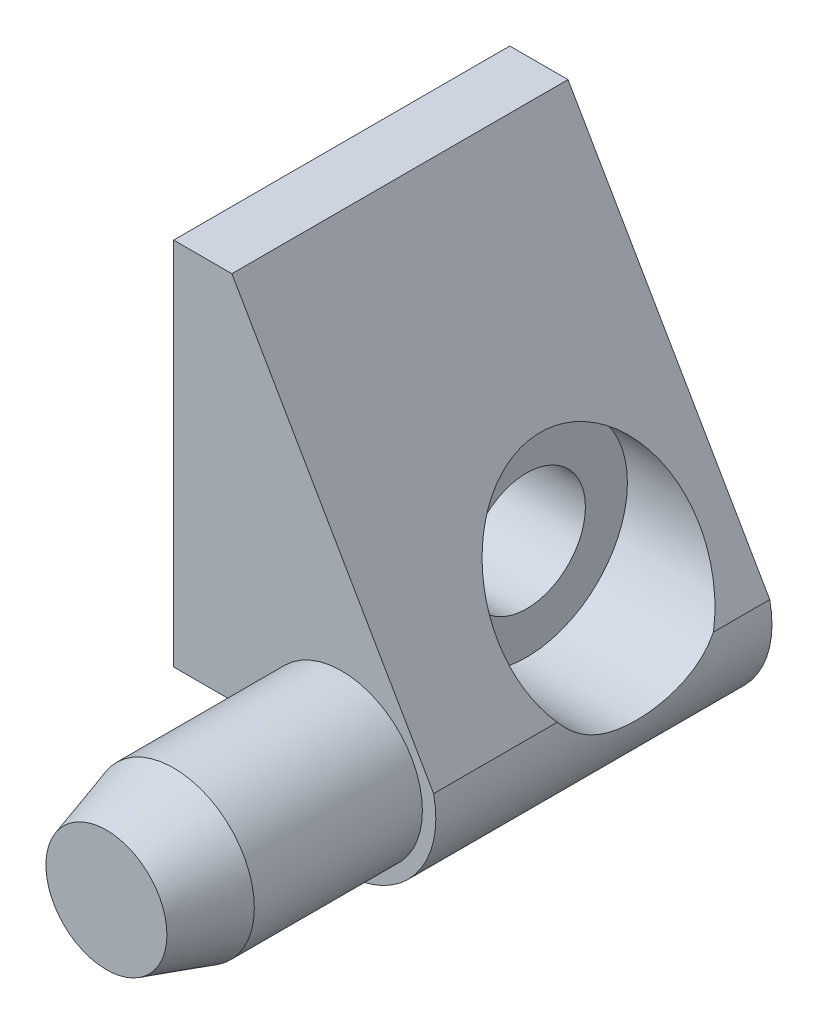
ISO-10303-21;
HEADER;
FILE_DESCRIPTION(('STEP AP214'),'2;1');
FILE_NAME('part.step','',(''),(''),'','','');
FILE_SCHEMA(('AUTOMOTIVE_DESIGN { 1 0 10303 214 1 1 1 1 }'));
ENDSEC;
DATA;
#1=APPLICATION_CONTEXT('core data for automotive mechanical design processes');
#2=APPLICATION_PROTOCOL_DEFINITION('international standard','automotive_design',2000,#1);
#3=PRODUCT_CONTEXT('',#1,'mechanical');
#4=PRODUCT('Part','Part','',(#3));
#5=PRODUCT_RELATED_PRODUCT_CATEGORY('part','',(#4));
#6=PRODUCT_DEFINITION_FORMATION('','',#4);
#7=PRODUCT_DEFINITION_CONTEXT('part definition',#1,'design');
#8=PRODUCT_DEFINITION('design','',#6,#7);
#9=PRODUCT_DEFINITION_SHAPE('','',#8);
#10=(LENGTH_UNIT() NAMED_UNIT(*) SI_UNIT(.MILLI.,.METRE.));
#11=(NAMED_UNIT(*) PLANE_ANGLE_UNIT() SI_UNIT($,.RADIAN.));
#12=(NAMED_UNIT(*) SI_UNIT($,.STERADIAN.) SOLID_ANGLE_UNIT());
#13=UNCERTAINTY_MEASURE_WITH_UNIT(LENGTH_MEASURE(1.E-05),#10,'distance_accuracy_value','');
#14=(GEOMETRIC_REPRESENTATION_CONTEXT(3) GLOBAL_UNCERTAINTY_ASSIGNED_CONTEXT((#13)) GLOBAL_UNIT_ASSIGNED_CONTEXT((#10,
#11,#12)) REPRESENTATION_CONTEXT('',''));
#15=CARTESIAN_POINT('',(0.,0.,0.));
#16=DIRECTION('',(0.,0.,1.));
#17=DIRECTION('',(1.,0.,0.));
#18=AXIS2_PLACEMENT_3D('',#15,#16,#17);
#19=CARTESIAN_POINT('',(0.,6.,10.));
#20=DIRECTION('',(0.,0.,-1.));
#21=DIRECTION('',(-1.,0.,0.));
#22=AXIS2_PLACEMENT_3D('',#19,#20,#21);
#23=CYLINDRICAL_SURFACE('',#22,2.8);
#24=CARTESIAN_POINT('',(2.73401258824942,6.60429725077458,6.32514754081954));
#25=CARTESIAN_POINT('',(2.74718072656134,6.54473329061629,6.27661206166968));
#26=CARTESIAN_POINT('',(2.75794742641717,6.48677528015598,6.22552383453521));
#27=CARTESIAN_POINT('',(2.775391199646,6.37471394469099,6.11875155349098));
#28=CARTESIAN_POINT('',(2.78207281882174,6.32060639444985,6.06307268657882));
#29=CARTESIAN_POINT('',(2.79206208995295,6.21699944991811,5.94779236332611));
#30=CARTESIAN_POINT('',(2.79538558052693,6.16747943341758,5.88821074583283));
#31=CARTESIAN_POINT('',(2.7994418775473,6.0731566366032,5.76534300153487));
#32=CARTESIAN_POINT('',(2.80017400490563,6.02835509578867,5.70205590809603));
#33=CARTESIAN_POINT('',(2.79954975768704,5.90184872038577,5.50777857292563));
#34=CARTESIAN_POINT('',(2.79540389985316,5.82758274640864,5.37186011603755));
#35=CARTESIAN_POINT('',(2.78470302165556,5.70081697666656,5.09016963028011));
#36=CARTESIAN_POINT('',(2.77814520806697,5.64834256777212,4.94438633756374));
#37=CARTESIAN_POINT('',(2.76919130599023,5.58520062474181,4.7148162894273));
#38=CARTESIAN_POINT('',(2.7662646651996,5.5663925280862,4.63321228242288));
#39=CARTESIAN_POINT('',(2.76127449611067,5.5356593564555,4.46869879910973));
#40=CARTESIAN_POINT('',(2.75921071636998,5.52373227592951,4.3857897104267));
#41=CARTESIAN_POINT('',(2.75624346949717,5.5068528881893,4.21926112766045));
#42=CARTESIAN_POINT('',(2.75533981035914,5.50189942679221,4.13564175343976));
#43=CARTESIAN_POINT('',(2.75481438021028,5.49900057987198,3.96827778270407));
#44=CARTESIAN_POINT('',(2.75519258463052,5.50105506003073,3.88453318861987));
#45=CARTESIAN_POINT('',(2.75717608756015,5.51213613103983,3.71782328784866));
#46=CARTESIAN_POINT('',(2.75877699431904,5.52113777002203,3.63485626550932));
#47=CARTESIAN_POINT('',(2.76298008523361,5.54601778642342,3.46995838527709));
#48=CARTESIAN_POINT('',(2.7655826030893,5.56189845590444,3.38802788212051));
#49=CARTESIAN_POINT('',(2.77141200730581,5.60043174504579,3.22575015863993));
#50=CARTESIAN_POINT('',(2.77463924514248,5.62308818077207,3.14540385778031));
#51=CARTESIAN_POINT('',(2.7812006273411,5.67502627924548,2.98684313639012));
#52=CARTESIAN_POINT('',(2.78453482343692,5.70431119084126,2.90862978242611));
#53=CARTESIAN_POINT('',(2.79070057944241,5.76961819592607,2.75416158134688));
#54=CARTESIAN_POINT('',(2.79352702976725,5.80570201669808,2.6779326036758));
#55=CARTESIAN_POINT('',(2.79787921892826,5.88417516278746,2.52875473370924));
#56=CARTESIAN_POINT('',(2.79940503919917,5.92656409313559,2.45580563632564));
#57=CARTESIAN_POINT('',(2.80031296964785,6.0172377109699,2.31389099550421));
#58=CARTESIAN_POINT('',(2.799700176977,6.06550811570281,2.24491637801423));
#59=CARTESIAN_POINT('',(2.79544587567934,6.16760270048371,2.11135373200488));
#60=CARTESIAN_POINT('',(2.79180611423416,6.22142366102797,2.04676319622825));
#61=CARTESIAN_POINT('',(2.78113513814166,6.32844806847868,1.92875777478006));
#62=CARTESIAN_POINT('',(2.77448177351817,6.38116936040093,1.87487222508268));
#63=CARTESIAN_POINT('',(2.75731145841885,6.49018799656369,1.77147299376054));
#64=CARTESIAN_POINT('',(2.74679283290449,6.54648688241882,1.72196121909831));
#65=CARTESIAN_POINT('',(2.73401258824942,6.60429725077458,1.67485245918046));
#66=B_SPLINE_CURVE_WITH_KNOTS('',3,(#24,#25,#26,#27,#28,#29,#30,#31,#32,#33,#34,#35,#36,#37,#38,
#39,#40,#41,#42,#43,#44,#45,#46,#47,#48,#49,#50,#51,#52,#53,#54,#55,#56,#57,#58,#59,#60,#61,#62,
#63,#64,#65),.UNSPECIFIED.,.F.,.F.,(4,2,2,2,2,2,2,2,2,2,2,2,2,2,2,2,2,2,2,2,4),(0.,
0.233707661765087,0.467154782332596,0.699495636168674,0.931897372330957,1.39465974870193,
1.85795973460061,2.10908726514052,2.36014156466199,2.61115430804974,2.86216224041415,
3.11227280810749,3.36246677568963,3.61280191703674,3.86326002314185,4.11611235781464,
4.36894885979388,4.62118316542379,4.87327198110804,5.10001080169107,5.32684799726922),.UNSPECIFIED.);
#67=CARTESIAN_POINT('',(2.73401258824942,6.60429725077458,6.32514754081954));
#68=VERTEX_POINT('',#67);
#69=CARTESIAN_POINT('',(2.73401258824942,6.60429725077458,1.67485245918047));
#70=VERTEX_POINT('',#69);
#71=EDGE_CURVE('E48',#68,#70,#66,.T.);
#72=ORIENTED_EDGE('',*,*,#71,.F.);
#73=DIRECTION('',(0.,0.,-1.));
#74=VECTOR('',#73,1.);
#75=CARTESIAN_POINT('',(2.73401258824942,6.60429725077458,10.));
#76=LINE('',#75,#74);
#77=CARTESIAN_POINT('',(2.73401258824942,6.60429725077458,10.));
#78=VERTEX_POINT('',#77);
#79=EDGE_CURVE('E56',#78,#68,#76,.T.);
#80=ORIENTED_EDGE('',*,*,#79,.F.);
#81=CARTESIAN_POINT('',(0.,6.,10.));
#82=DIRECTION('',(0.,0.,-1.));
#83=DIRECTION('',(-1.,0.,0.));
#84=AXIS2_PLACEMENT_3D('',#81,#82,#83);
#85=CIRCLE('',#84,2.8);
#86=CARTESIAN_POINT('',(-2.8,6.,10.));
#87=VERTEX_POINT('',#86);
#88=EDGE_CURVE('E122',#78,#87,#85,.T.);
#89=ORIENTED_EDGE('',*,*,#88,.T.);
#90=DIRECTION('',(0.,0.,-1.));
#91=VECTOR('',#90,1.);
#92=CARTESIAN_POINT('',(-2.8,6.,10.));
#93=LINE('',#92,#91);
#94=CARTESIAN_POINT('',(-2.8,6.,0.));
#95=VERTEX_POINT('',#94);
#96=EDGE_CURVE('E89',#87,#95,#93,.T.);
#97=ORIENTED_EDGE('',*,*,#96,.T.);
#98=CARTESIAN_POINT('',(0.,6.,0.));
#99=DIRECTION('',(0.,0.,-1.));
#100=DIRECTION('',(-1.,0.,0.));
#101=AXIS2_PLACEMENT_3D('',#98,#99,#100);
#102=CIRCLE('',#101,2.8);
#103=CARTESIAN_POINT('',(2.73401258824942,6.60429725077458,0.));
#104=VERTEX_POINT('',#103);
#105=EDGE_CURVE('E127',#104,#95,#102,.T.);
#106=ORIENTED_EDGE('',*,*,#105,.F.);
#107=EDGE_CURVE('E81',#70,#104,#76,.T.);
#108=ORIENTED_EDGE('',*,*,#107,.F.);
#109=EDGE_LOOP('',(#72,#80,#89,#97,#106,#108));
#110=FACE_BOUND('',#109,.T.);
#111=ADVANCED_FACE('F35',(#110),#23,.T.);
#112=CARTESIAN_POINT('',(-3.267949192431,17.,10.));
#113=DIRECTION('',(0.866025403784446,0.499999999999987,0.));
#114=DIRECTION('',(-0.499999999999987,0.866025403784446,0.));
#115=AXIS2_PLACEMENT_3D('',#112,#113,#114);
#116=PLANE('',#115);
#117=CARTESIAN_POINT('',(1.63952809568065,8.5,4.));
#118=DIRECTION('',(0.866025403784446,0.499999999999987,0.));
#119=DIRECTION('',(0.499999999999987,-0.866025403784446,0.));
#120=AXIS2_PLACEMENT_3D('',#117,#118,#119);
#121=ELLIPSE('',#120,3.46410161513772,3.);
#122=EDGE_CURVE('E11',#70,#68,#121,.T.);
#123=ORIENTED_EDGE('',*,*,#122,.F.);
#124=ORIENTED_EDGE('',*,*,#107,.T.);
#125=DIRECTION('',(0.499999999999987,-0.866025403784446,0.));
#126=VECTOR('',#125,1.);
#127=CARTESIAN_POINT('',(-3.267949192431,17.,0.));
#128=LINE('',#127,#126);
#129=CARTESIAN_POINT('',(-3.267949192431,17.,0.));
#130=VERTEX_POINT('',#129);
#131=EDGE_CURVE('E137',#130,#104,#128,.T.);
#132=ORIENTED_EDGE('',*,*,#131,.F.);
#133=DIRECTION('',(0.,0.,-1.));
#134=VECTOR('',#133,1.);
#135=CARTESIAN_POINT('',(-3.267949192431,17.,10.));
#136=LINE('',#135,#134);
#137=CARTESIAN_POINT('',(-3.267949192431,17.,10.));
#138=VERTEX_POINT('',#137);
#139=EDGE_CURVE('E109',#138,#130,#136,.T.);
#140=ORIENTED_EDGE('',*,*,#139,.F.);
#141=DIRECTION('',(0.499999999999987,-0.866025403784446,0.));
#142=VECTOR('',#141,1.);
#143=CARTESIAN_POINT('',(-3.267949192431,17.,10.));
#144=LINE('',#143,#142);
#145=EDGE_CURVE('E117',#138,#78,#144,.T.);
#146=ORIENTED_EDGE('',*,*,#145,.T.);
#147=ORIENTED_EDGE('',*,*,#79,.T.);
#148=EDGE_LOOP('',(#123,#124,#132,#140,#146,#147));
#149=FACE_BOUND('',#148,.T.);
#150=ADVANCED_FACE('F145',(#149),#116,.T.);
#151=CARTESIAN_POINT('',(-5.,17.,10.));
#152=DIRECTION('',(0.,1.,0.));
#153=DIRECTION('',(0.,0.,1.));
#154=AXIS2_PLACEMENT_3D('',#151,#152,#153);
#155=PLANE('',#154);
#156=DIRECTION('',(1.,0.,0.));
#157=VECTOR('',#156,1.);
#158=CARTESIAN_POINT('',(-5.,17.,0.));
#159=LINE('',#158,#157);
#160=CARTESIAN_POINT('',(-5.,17.,0.));
#161=VERTEX_POINT('',#160);
#162=EDGE_CURVE('E104',#161,#130,#159,.T.);
#163=ORIENTED_EDGE('',*,*,#162,.F.);
#164=DIRECTION('',(0.,0.,-1.));
#165=VECTOR('',#164,1.);
#166=CARTESIAN_POINT('',(-5.,17.,10.));
#167=LINE('',#166,#165);
#168=CARTESIAN_POINT('',(-5.,17.,10.));
#169=VERTEX_POINT('',#168);
#170=EDGE_CURVE('E98',#169,#161,#167,.T.);
#171=ORIENTED_EDGE('',*,*,#170,.F.);
#172=DIRECTION('',(1.,0.,0.));
#173=VECTOR('',#172,1.);
#174=CARTESIAN_POINT('',(-5.,17.,10.));
#175=LINE('',#174,#173);
#176=EDGE_CURVE('E101',#169,#138,#175,.T.);
#177=ORIENTED_EDGE('',*,*,#176,.T.);
#178=ORIENTED_EDGE('',*,*,#139,.T.);
#179=EDGE_LOOP('',(#163,#171,#177,#178));
#180=FACE_BOUND('',#179,.T.);
#181=ADVANCED_FACE('F100',(#180),#155,.T.);
#182=CARTESIAN_POINT('',(-5.,6.,10.));
#183=DIRECTION('',(-1.,0.,0.));
#184=DIRECTION('',(0.,0.,1.));
#185=AXIS2_PLACEMENT_3D('',#182,#183,#184);
#186=PLANE('',#185);
#187=CARTESIAN_POINT('',(-5.,8.5,4.));
#188=DIRECTION('',(1.,0.,0.));
#189=DIRECTION('',(0.,0.,-1.));
#190=AXIS2_PLACEMENT_3D('',#187,#188,#189);
#191=CIRCLE('',#190,1.75000000000001);
#192=CARTESIAN_POINT('',(-5.,8.5,2.24999999999999));
#193=VERTEX_POINT('',#192);
#194=EDGE_CURVE('E149',#193,#193,#191,.T.);
#195=ORIENTED_EDGE('',*,*,#194,.T.);
#196=EDGE_LOOP('',(#195));
#197=FACE_BOUND('',#196,.T.);
#198=DIRECTION('',(0.,1.,0.));
#199=VECTOR('',#198,1.);
#200=CARTESIAN_POINT('',(-5.,6.,0.));
#201=LINE('',#200,#199);
#202=CARTESIAN_POINT('',(-5.,6.,0.));
#203=VERTEX_POINT('',#202);
#204=EDGE_CURVE('E134',#203,#161,#201,.T.);
#205=ORIENTED_EDGE('',*,*,#204,.F.);
#206=DIRECTION('',(0.,0.,-1.));
#207=VECTOR('',#206,1.);
#208=CARTESIAN_POINT('',(-5.,6.,10.));
#209=LINE('',#208,#207);
#210=CARTESIAN_POINT('',(-5.,6.,10.));
#211=VERTEX_POINT('',#210);
#212=EDGE_CURVE('E110',#211,#203,#209,.T.);
#213=ORIENTED_EDGE('',*,*,#212,.F.);
#214=DIRECTION('',(0.,1.,0.));
#215=VECTOR('',#214,1.);
#216=CARTESIAN_POINT('',(-5.,6.,10.));
#217=LINE('',#216,#215);
#218=EDGE_CURVE('E115',#211,#169,#217,.T.);
#219=ORIENTED_EDGE('',*,*,#218,.T.);
#220=ORIENTED_EDGE('',*,*,#170,.T.);
#221=EDGE_LOOP('',(#205,#213,#219,#220));
#222=FACE_BOUND('',#221,.T.);
#223=ADVANCED_FACE('F119',(#197,#222),#186,.T.);
#224=CARTESIAN_POINT('',(-2.8,6.,10.));
#225=DIRECTION('',(0.,-1.,0.));
#226=DIRECTION('',(1.,0.,0.));
#227=AXIS2_PLACEMENT_3D('',#224,#225,#226);
#228=PLANE('',#227);
#229=DIRECTION('',(-1.,0.,0.));
#230=VECTOR('',#229,1.);
#231=CARTESIAN_POINT('',(-2.8,6.,0.));
#232=LINE('',#231,#230);
#233=EDGE_CURVE('E130',#95,#203,#232,.T.);
#234=ORIENTED_EDGE('',*,*,#233,.F.);
#235=ORIENTED_EDGE('',*,*,#96,.F.);
#236=DIRECTION('',(-1.,0.,0.));
#237=VECTOR('',#236,1.);
#238=CARTESIAN_POINT('',(-2.8,6.,10.));
#239=LINE('',#238,#237);
#240=EDGE_CURVE('E120',#87,#211,#239,.T.);
#241=ORIENTED_EDGE('',*,*,#240,.T.);
#242=ORIENTED_EDGE('',*,*,#212,.T.);
#243=EDGE_LOOP('',(#234,#235,#241,#242));
#244=FACE_BOUND('',#243,.T.);
#245=ADVANCED_FACE('F142',(#244),#228,.T.);
#246=CARTESIAN_POINT('',(0.,6.,10.));
#247=DIRECTION('',(0.,0.,-1.));
#248=DIRECTION('',(-1.,0.,0.));
#249=AXIS2_PLACEMENT_3D('',#246,#247,#248);
#250=PLANE('',#249);
#251=CARTESIAN_POINT('',(0.,6.,10.));
#252=DIRECTION('',(0.,0.,1.));
#253=DIRECTION('',(1.,0.,0.));
#254=AXIS2_PLACEMENT_3D('',#251,#252,#253);
#255=CIRCLE('',#254,2.4);
#256=CARTESIAN_POINT('',(2.4,6.,10.));
#257=VERTEX_POINT('',#256);
#258=EDGE_CURVE('E43',#257,#257,#255,.T.);
#259=ORIENTED_EDGE('',*,*,#258,.F.);
#260=EDGE_LOOP('',(#259));
#261=FACE_BOUND('',#260,.T.);
#262=ORIENTED_EDGE('',*,*,#88,.F.);
#263=ORIENTED_EDGE('',*,*,#145,.F.);
#264=ORIENTED_EDGE('',*,*,#176,.F.);
#265=ORIENTED_EDGE('',*,*,#218,.F.);
#266=ORIENTED_EDGE('',*,*,#240,.F.);
#267=EDGE_LOOP('',(#262,#263,#264,#265,#266));
#268=FACE_BOUND('',#267,.T.);
#269=ADVANCED_FACE('F114',(#261,#268),#250,.F.);
#270=CARTESIAN_POINT('',(0.,6.,0.));
#271=DIRECTION('',(0.,0.,-1.));
#272=DIRECTION('',(-1.,0.,0.));
#273=AXIS2_PLACEMENT_3D('',#270,#271,#272);
#274=PLANE('',#273);
#275=ORIENTED_EDGE('',*,*,#105,.T.);
#276=ORIENTED_EDGE('',*,*,#233,.T.);
#277=ORIENTED_EDGE('',*,*,#204,.T.);
#278=ORIENTED_EDGE('',*,*,#162,.T.);
#279=ORIENTED_EDGE('',*,*,#131,.T.);
#280=EDGE_LOOP('',(#275,#276,#277,#278,#279));
#281=FACE_BOUND('',#280,.T.);
#282=ADVANCED_FACE('F144',(#281),#274,.T.);
#283=CARTESIAN_POINT('',(0.,6.,10.));
#284=DIRECTION('',(0.,0.,1.));
#285=DIRECTION('',(1.,0.,0.));
#286=AXIS2_PLACEMENT_3D('',#283,#284,#285);
#287=CYLINDRICAL_SURFACE('',#286,2.4);
#288=ORIENTED_EDGE('',*,*,#258,.T.);
#289=EDGE_LOOP('',(#288));
#290=FACE_BOUND('',#289,.T.);
#291=CARTESIAN_POINT('',(0.,6.,15.0000000000609));
#292=DIRECTION('',(0.,0.,1.));
#293=DIRECTION('',(1.,0.,0.));
#294=AXIS2_PLACEMENT_3D('',#291,#292,#293);
#295=CIRCLE('',#294,2.4);
#296=CARTESIAN_POINT('',(2.4,6.,15.0000000000609));
#297=VERTEX_POINT('',#296);
#298=EDGE_CURVE('E148',#297,#297,#295,.T.);
#299=ORIENTED_EDGE('',*,*,#298,.F.);
#300=EDGE_LOOP('',(#299));
#301=FACE_BOUND('',#300,.T.);
#302=ADVANCED_FACE('F181',(#290,#301),#287,.T.);
#303=CARTESIAN_POINT('',(0.,6.,17.));
#304=DIRECTION('',(0.,0.,1.));
#305=DIRECTION('',(1.,0.,0.));
#306=AXIS2_PLACEMENT_3D('',#303,#304,#305);
#307=PLANE('',#306);
#308=CARTESIAN_POINT('',(0.,6.,17.));
#309=DIRECTION('',(0.,0.,1.));
#310=DIRECTION('',(1.,0.,0.));
#311=AXIS2_PLACEMENT_3D('',#308,#309,#310);
#312=CIRCLE('',#311,1.80000000000859);
#313=CARTESIAN_POINT('',(1.80000000000859,6.,17.));
#314=VERTEX_POINT('',#313);
#315=EDGE_CURVE('E131',#314,#314,#312,.T.);
#316=ORIENTED_EDGE('',*,*,#315,.T.);
#317=EDGE_LOOP('',(#316));
#318=FACE_BOUND('',#317,.T.);
#319=ADVANCED_FACE('F177',(#318),#307,.T.);
#320=CARTESIAN_POINT('',(0.,6.,17.));
#321=DIRECTION('',(0.,0.,-1.));
#322=DIRECTION('',(-1.,0.,0.));
#323=AXIS2_PLACEMENT_3D('',#320,#321,#322);
#324=CONICAL_SURFACE('',#323,1.80000000000859,0.29145679448231);
#325=ORIENTED_EDGE('',*,*,#298,.T.);
#326=EDGE_LOOP('',(#325));
#327=FACE_BOUND('',#326,.T.);
#328=ORIENTED_EDGE('',*,*,#315,.F.);
#329=EDGE_LOOP('',(#328));
#330=FACE_BOUND('',#329,.T.);
#331=ADVANCED_FACE('F173',(#327,#330),#324,.T.);
#332=CARTESIAN_POINT('',(2.8,8.5,4.));
#333=DIRECTION('',(1.,0.,0.));
#334=DIRECTION('',(0.,0.,-1.));
#335=AXIS2_PLACEMENT_3D('',#332,#333,#334);
#336=CYLINDRICAL_SURFACE('',#335,1.75000000000001);
#337=ORIENTED_EDGE('',*,*,#194,.F.);
#338=EDGE_LOOP('',(#337));
#339=FACE_BOUND('',#338,.T.);
#340=CARTESIAN_POINT('',(-0.499999999999998,8.5,4.));
#341=DIRECTION('',(1.,0.,0.));
#342=DIRECTION('',(0.,0.,-1.));
#343=AXIS2_PLACEMENT_3D('',#340,#341,#342);
#344=CIRCLE('',#343,1.75000000000001);
#345=CARTESIAN_POINT('',(-0.499999999999998,8.5,2.24999999999999));
#346=VERTEX_POINT('',#345);
#347=EDGE_CURVE('E154',#346,#346,#344,.T.);
#348=ORIENTED_EDGE('',*,*,#347,.T.);
#349=EDGE_LOOP('',(#348));
#350=FACE_BOUND('',#349,.T.);
#351=ADVANCED_FACE('F169',(#339,#350),#336,.F.);
#352=CARTESIAN_POINT('',(-0.499999999999998,10.25,4.));
#353=DIRECTION('',(-1.,0.,0.));
#354=DIRECTION('',(0.,0.,1.));
#355=AXIS2_PLACEMENT_3D('',#352,#353,#354);
#356=PLANE('',#355);
#357=ORIENTED_EDGE('',*,*,#347,.F.);
#358=EDGE_LOOP('',(#357));
#359=FACE_BOUND('',#358,.T.);
#360=CARTESIAN_POINT('',(-0.499999999999998,8.5,4.));
#361=DIRECTION('',(1.,0.,0.));
#362=DIRECTION('',(0.,0.,-1.));
#363=AXIS2_PLACEMENT_3D('',#360,#361,#362);
#364=CIRCLE('',#363,3.);
#365=CARTESIAN_POINT('',(-0.499999999999999,8.5,1.));
#366=VERTEX_POINT('',#365);
#367=EDGE_CURVE('E281',#366,#366,#364,.T.);
#368=ORIENTED_EDGE('',*,*,#367,.T.);
#369=EDGE_LOOP('',(#368));
#370=FACE_BOUND('',#369,.T.);
#371=ADVANCED_FACE('F166',(#359,#370),#356,.F.);
#372=CARTESIAN_POINT('',(2.8,8.5,4.));
#373=DIRECTION('',(1.,0.,0.));
#374=DIRECTION('',(0.,0.,-1.));
#375=AXIS2_PLACEMENT_3D('',#372,#373,#374);
#376=CYLINDRICAL_SURFACE('',#375,3.);
#377=ORIENTED_EDGE('',*,*,#71,.T.);
#378=ORIENTED_EDGE('',*,*,#122,.T.);
#379=EDGE_LOOP('',(#377,#378));
#380=FACE_BOUND('',#379,.T.);
#381=ORIENTED_EDGE('',*,*,#367,.F.);
#382=EDGE_LOOP('',(#381));
#383=FACE_BOUND('',#382,.T.);
#384=ADVANCED_FACE('F146',(#380,#383),#376,.F.);
#385=CLOSED_SHELL('',(#111,#150,#181,#223,#245,#269,#282,#302,#319,#331,#351,#371,#384));
#386=MANIFOLD_SOLID_BREP('B2',#385);
#387=ADVANCED_BREP_SHAPE_REPRESENTATION('',(#18,#386),#14);
#388=SHAPE_DEFINITION_REPRESENTATION(#9,#387);
ENDSEC;
END-ISO-10303-21;
